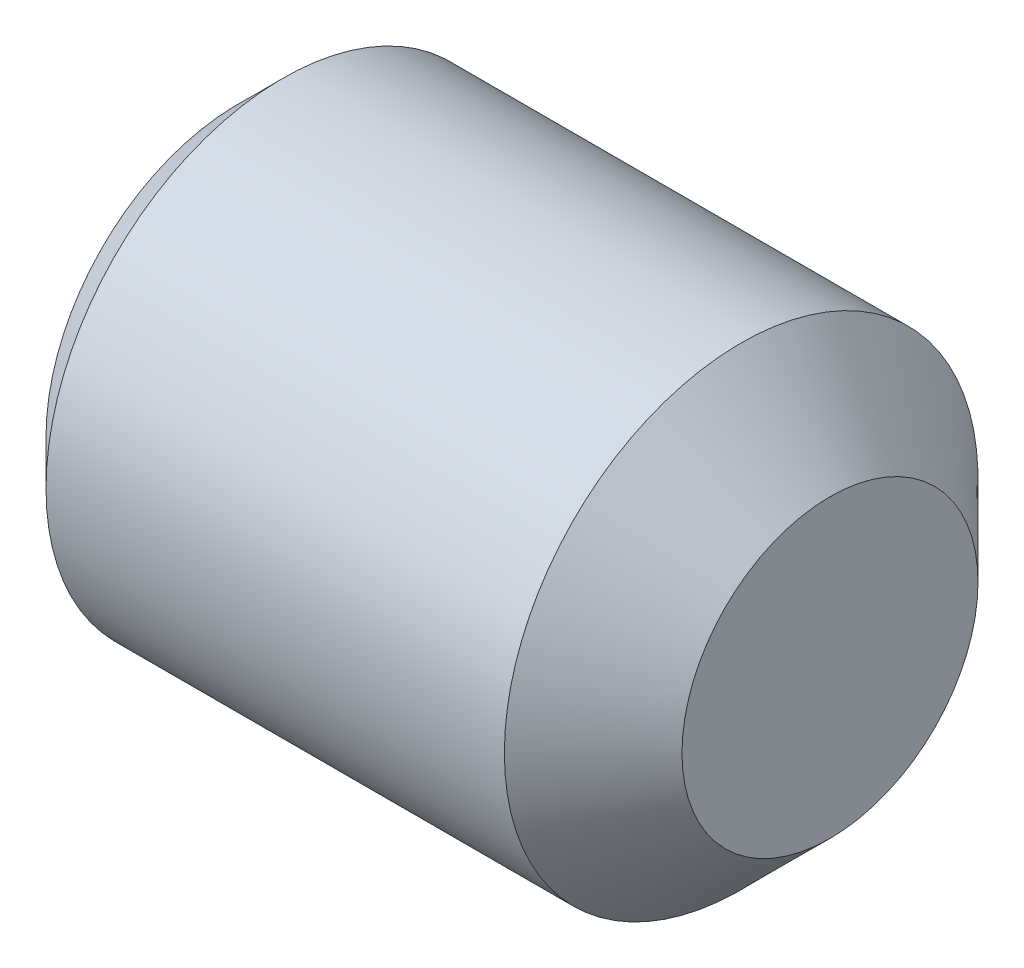
ISO-10303-21;
HEADER;
FILE_DESCRIPTION(('STEP AP214'),'2;1');
FILE_NAME('part.step','',(''),(''),'','','');
FILE_SCHEMA(('AUTOMOTIVE_DESIGN { 1 0 10303 214 1 1 1 1 }'));
ENDSEC;
DATA;
#1=APPLICATION_CONTEXT('core data for automotive mechanical design processes');
#2=APPLICATION_PROTOCOL_DEFINITION('international standard','automotive_design',2000,#1);
#3=PRODUCT_CONTEXT('',#1,'mechanical');
#4=PRODUCT('Part','Part','',(#3));
#5=PRODUCT_RELATED_PRODUCT_CATEGORY('part','',(#4));
#6=PRODUCT_DEFINITION_FORMATION('','',#4);
#7=PRODUCT_DEFINITION_CONTEXT('part definition',#1,'design');
#8=PRODUCT_DEFINITION('design','',#6,#7);
#9=PRODUCT_DEFINITION_SHAPE('','',#8);
#10=(LENGTH_UNIT() NAMED_UNIT(*) SI_UNIT(.MILLI.,.METRE.));
#11=(NAMED_UNIT(*) PLANE_ANGLE_UNIT() SI_UNIT($,.RADIAN.));
#12=(NAMED_UNIT(*) SI_UNIT($,.STERADIAN.) SOLID_ANGLE_UNIT());
#13=UNCERTAINTY_MEASURE_WITH_UNIT(LENGTH_MEASURE(1.E-05),#10,'distance_accuracy_value','');
#14=(GEOMETRIC_REPRESENTATION_CONTEXT(3) GLOBAL_UNCERTAINTY_ASSIGNED_CONTEXT((#13)) GLOBAL_UNIT_ASSIGNED_CONTEXT((#10,
#11,#12)) REPRESENTATION_CONTEXT('',''));
#15=CARTESIAN_POINT('',(0.,0.,0.));
#16=DIRECTION('',(0.,0.,1.));
#17=DIRECTION('',(1.,0.,0.));
#18=AXIS2_PLACEMENT_3D('',#15,#16,#17);
#19=CARTESIAN_POINT('',(0.,0.,0.));
#20=DIRECTION('',(1.,0.,0.));
#21=DIRECTION('',(0.,0.,-1.));
#22=AXIS2_PLACEMENT_3D('',#19,#20,#21);
#23=PLANE('',#22);
#24=CARTESIAN_POINT('',(0.,0.,0.));
#25=DIRECTION('',(-1.,0.,0.));
#26=DIRECTION('',(0.,0.,1.));
#27=AXIS2_PLACEMENT_3D('',#24,#25,#26);
#28=CIRCLE('',#27,1.621);
#29=CARTESIAN_POINT('',(0.,0.,1.621));
#30=VERTEX_POINT('',#29);
#31=EDGE_CURVE('E11',#30,#30,#28,.T.);
#32=ORIENTED_EDGE('',*,*,#31,.T.);
#33=EDGE_LOOP('',(#32));
#34=FACE_BOUND('',#33,.T.);
#35=DIRECTION('',(0.,-0.5,-0.866025403784439));
#36=VECTOR('',#35,1.);
#37=CARTESIAN_POINT('',(0.,1.15470053837925,0.));
#38=LINE('',#37,#36);
#39=CARTESIAN_POINT('',(0.,1.15470053837925,0.));
#40=VERTEX_POINT('',#39);
#41=CARTESIAN_POINT('',(0.,0.577350269189626,-1.));
#42=VERTEX_POINT('',#41);
#43=EDGE_CURVE('E149',#40,#42,#38,.T.);
#44=ORIENTED_EDGE('',*,*,#43,.F.);
#45=DIRECTION('',(0.,0.5,-0.866025403784439));
#46=VECTOR('',#45,1.);
#47=CARTESIAN_POINT('',(0.,0.577350269189626,1.));
#48=LINE('',#47,#46);
#49=CARTESIAN_POINT('',(0.,0.577350269189626,1.));
#50=VERTEX_POINT('',#49);
#51=EDGE_CURVE('E50',#50,#40,#48,.T.);
#52=ORIENTED_EDGE('',*,*,#51,.F.);
#53=DIRECTION('',(0.,1.,0.));
#54=VECTOR('',#53,1.);
#55=CARTESIAN_POINT('',(0.,-0.577350269189626,1.));
#56=LINE('',#55,#54);
#57=CARTESIAN_POINT('',(0.,-0.577350269189626,1.));
#58=VERTEX_POINT('',#57);
#59=EDGE_CURVE('E120',#58,#50,#56,.T.);
#60=ORIENTED_EDGE('',*,*,#59,.F.);
#61=DIRECTION('',(0.,0.5,0.866025403784439));
#62=VECTOR('',#61,1.);
#63=CARTESIAN_POINT('',(0.,-1.15470053837925,0.));
#64=LINE('',#63,#62);
#65=CARTESIAN_POINT('',(0.,-1.15470053837925,0.));
#66=VERTEX_POINT('',#65);
#67=EDGE_CURVE('E155',#66,#58,#64,.T.);
#68=ORIENTED_EDGE('',*,*,#67,.F.);
#69=DIRECTION('',(0.,-0.5,0.866025403784439));
#70=VECTOR('',#69,1.);
#71=CARTESIAN_POINT('',(0.,-0.577350269189626,-1.));
#72=LINE('',#71,#70);
#73=CARTESIAN_POINT('',(0.,-0.577350269189626,-1.));
#74=VERTEX_POINT('',#73);
#75=EDGE_CURVE('E153',#74,#66,#72,.T.);
#76=ORIENTED_EDGE('',*,*,#75,.F.);
#77=DIRECTION('',(0.,-1.,0.));
#78=VECTOR('',#77,1.);
#79=CARTESIAN_POINT('',(0.,0.577350269189626,-1.));
#80=LINE('',#79,#78);
#81=EDGE_CURVE('E151',#42,#74,#80,.T.);
#82=ORIENTED_EDGE('',*,*,#81,.F.);
#83=EDGE_LOOP('',(#44,#52,#60,#68,#76,#82));
#84=FACE_BOUND('',#83,.T.);
#85=ADVANCED_FACE('F36',(#34,#84),#23,.F.);
#86=CARTESIAN_POINT('',(0.378999999999999,0.,0.));
#87=DIRECTION('',(1.,0.,0.));
#88=DIRECTION('',(0.,0.,-1.));
#89=AXIS2_PLACEMENT_3D('',#86,#87,#88);
#90=CONICAL_SURFACE('',#89,2.,0.78539816339745);
#91=ORIENTED_EDGE('',*,*,#31,.F.);
#92=EDGE_LOOP('',(#91));
#93=FACE_BOUND('',#92,.T.);
#94=CARTESIAN_POINT('',(0.378999999999999,0.,0.));
#95=DIRECTION('',(-1.,0.,0.));
#96=DIRECTION('',(0.,0.,1.));
#97=AXIS2_PLACEMENT_3D('',#94,#95,#96);
#98=CIRCLE('',#97,2.);
#99=CARTESIAN_POINT('',(0.378999999999999,0.,2.));
#100=VERTEX_POINT('',#99);
#101=EDGE_CURVE('E43',#100,#100,#98,.T.);
#102=ORIENTED_EDGE('',*,*,#101,.T.);
#103=EDGE_LOOP('',(#102));
#104=FACE_BOUND('',#103,.T.);
#105=ADVANCED_FACE('F184',(#93,#104),#90,.T.);
#106=CARTESIAN_POINT('',(0.,0.,0.));
#107=DIRECTION('',(-1.,0.,0.));
#108=DIRECTION('',(0.,0.,1.));
#109=AXIS2_PLACEMENT_3D('',#106,#107,#108);
#110=CYLINDRICAL_SURFACE('',#109,2.);
#111=ORIENTED_EDGE('',*,*,#101,.F.);
#112=EDGE_LOOP('',(#111));
#113=FACE_BOUND('',#112,.T.);
#114=CARTESIAN_POINT('',(4.25,0.,0.));
#115=DIRECTION('',(-1.,0.,0.));
#116=DIRECTION('',(0.,0.,1.));
#117=AXIS2_PLACEMENT_3D('',#114,#115,#116);
#118=CIRCLE('',#117,2.);
#119=CARTESIAN_POINT('',(4.25,0.,2.));
#120=VERTEX_POINT('',#119);
#121=EDGE_CURVE('E179',#120,#120,#118,.T.);
#122=ORIENTED_EDGE('',*,*,#121,.T.);
#123=EDGE_LOOP('',(#122));
#124=FACE_BOUND('',#123,.T.);
#125=ADVANCED_FACE('F186',(#113,#124),#110,.T.);
#126=CARTESIAN_POINT('',(5.,0.,0.));
#127=DIRECTION('',(-1.,0.,0.));
#128=DIRECTION('',(0.,0.,1.));
#129=AXIS2_PLACEMENT_3D('',#126,#127,#128);
#130=CONICAL_SURFACE('',#129,1.25,0.785398163397446);
#131=ORIENTED_EDGE('',*,*,#121,.F.);
#132=EDGE_LOOP('',(#131));
#133=FACE_BOUND('',#132,.T.);
#134=CARTESIAN_POINT('',(5.,0.,0.));
#135=DIRECTION('',(-1.,0.,0.));
#136=DIRECTION('',(0.,0.,1.));
#137=AXIS2_PLACEMENT_3D('',#134,#135,#136);
#138=CIRCLE('',#137,1.25);
#139=CARTESIAN_POINT('',(5.,0.,1.25));
#140=VERTEX_POINT('',#139);
#141=EDGE_CURVE('E176',#140,#140,#138,.T.);
#142=ORIENTED_EDGE('',*,*,#141,.T.);
#143=EDGE_LOOP('',(#142));
#144=FACE_BOUND('',#143,.T.);
#145=ADVANCED_FACE('F189',(#133,#144),#130,.T.);
#146=CARTESIAN_POINT('',(5.,1.25,0.));
#147=DIRECTION('',(-1.,0.,0.));
#148=DIRECTION('',(0.,0.,1.));
#149=AXIS2_PLACEMENT_3D('',#146,#147,#148);
#150=PLANE('',#149);
#151=ORIENTED_EDGE('',*,*,#141,.F.);
#152=EDGE_LOOP('',(#151));
#153=FACE_BOUND('',#152,.T.);
#154=ADVANCED_FACE('F195',(#153),#150,.F.);
#155=CARTESIAN_POINT('',(2.5,0.577350269189626,1.));
#156=DIRECTION('',(0.,0.866025403784439,0.5));
#157=DIRECTION('',(0.,-0.5,0.866025403784439));
#158=AXIS2_PLACEMENT_3D('',#155,#156,#157);
#159=PLANE('',#158);
#160=DIRECTION('',(0.,0.5,-0.866025403784439));
#161=VECTOR('',#160,1.);
#162=CARTESIAN_POINT('',(2.5,0.577350269189626,1.));
#163=LINE('',#162,#161);
#164=CARTESIAN_POINT('',(2.5,0.577350269189626,1.));
#165=VERTEX_POINT('',#164);
#166=CARTESIAN_POINT('',(2.5,0.866025403784439,0.5));
#167=VERTEX_POINT('',#166);
#168=EDGE_CURVE('E119',#165,#167,#163,.T.);
#169=ORIENTED_EDGE('',*,*,#168,.F.);
#170=DIRECTION('',(-1.,0.,0.));
#171=VECTOR('',#170,1.);
#172=CARTESIAN_POINT('',(2.5,0.577350269189626,1.));
#173=LINE('',#172,#171);
#174=EDGE_CURVE('E159',#165,#50,#173,.T.);
#175=ORIENTED_EDGE('',*,*,#174,.T.);
#176=ORIENTED_EDGE('',*,*,#51,.T.);
#177=DIRECTION('',(-1.,0.,0.));
#178=VECTOR('',#177,1.);
#179=CARTESIAN_POINT('',(2.5,1.15470053837925,0.));
#180=LINE('',#179,#178);
#181=CARTESIAN_POINT('',(2.5,1.15470053837925,0.));
#182=VERTEX_POINT('',#181);
#183=EDGE_CURVE('E122',#182,#40,#180,.T.);
#184=ORIENTED_EDGE('',*,*,#183,.F.);
#185=EDGE_CURVE('E111',#167,#182,#163,.T.);
#186=ORIENTED_EDGE('',*,*,#185,.F.);
#187=EDGE_LOOP('',(#169,#175,#176,#184,#186));
#188=FACE_BOUND('',#187,.T.);
#189=ADVANCED_FACE('F123',(#188),#159,.F.);
#190=CARTESIAN_POINT('',(2.5,-0.577350269189626,1.));
#191=DIRECTION('',(0.,0.,1.));
#192=DIRECTION('',(1.,0.,0.));
#193=AXIS2_PLACEMENT_3D('',#190,#191,#192);
#194=PLANE('',#193);
#195=DIRECTION('',(0.,1.,0.));
#196=VECTOR('',#195,1.);
#197=CARTESIAN_POINT('',(2.5,-0.577350269189626,1.));
#198=LINE('',#197,#196);
#199=CARTESIAN_POINT('',(2.5,-0.577350269189626,1.));
#200=VERTEX_POINT('',#199);
#201=CARTESIAN_POINT('',(2.5,0.,1.));
#202=VERTEX_POINT('',#201);
#203=EDGE_CURVE('E58',#200,#202,#198,.T.);
#204=ORIENTED_EDGE('',*,*,#203,.F.);
#205=DIRECTION('',(-1.,0.,0.));
#206=VECTOR('',#205,1.);
#207=CARTESIAN_POINT('',(2.5,-0.577350269189626,1.));
#208=LINE('',#207,#206);
#209=EDGE_CURVE('E162',#200,#58,#208,.T.);
#210=ORIENTED_EDGE('',*,*,#209,.T.);
#211=ORIENTED_EDGE('',*,*,#59,.T.);
#212=ORIENTED_EDGE('',*,*,#174,.F.);
#213=EDGE_CURVE('E146',#202,#165,#198,.T.);
#214=ORIENTED_EDGE('',*,*,#213,.F.);
#215=EDGE_LOOP('',(#204,#210,#211,#212,#214));
#216=FACE_BOUND('',#215,.T.);
#217=ADVANCED_FACE('F204',(#216),#194,.F.);
#218=CARTESIAN_POINT('',(2.5,-1.15470053837925,0.));
#219=DIRECTION('',(0.,-0.866025403784439,0.5));
#220=DIRECTION('',(0.,-0.5,-0.866025403784439));
#221=AXIS2_PLACEMENT_3D('',#218,#219,#220);
#222=PLANE('',#221);
#223=DIRECTION('',(0.,0.5,0.866025403784439));
#224=VECTOR('',#223,1.);
#225=CARTESIAN_POINT('',(2.5,-1.15470053837925,0.));
#226=LINE('',#225,#224);
#227=CARTESIAN_POINT('',(2.5,-1.15470053837925,0.));
#228=VERTEX_POINT('',#227);
#229=CARTESIAN_POINT('',(2.5,-0.866025403784439,0.5));
#230=VERTEX_POINT('',#229);
#231=EDGE_CURVE('E143',#228,#230,#226,.T.);
#232=ORIENTED_EDGE('',*,*,#231,.F.);
#233=DIRECTION('',(-1.,0.,0.));
#234=VECTOR('',#233,1.);
#235=CARTESIAN_POINT('',(2.5,-1.15470053837925,0.));
#236=LINE('',#235,#234);
#237=EDGE_CURVE('E165',#228,#66,#236,.T.);
#238=ORIENTED_EDGE('',*,*,#237,.T.);
#239=ORIENTED_EDGE('',*,*,#67,.T.);
#240=ORIENTED_EDGE('',*,*,#209,.F.);
#241=EDGE_CURVE('E142',#230,#200,#226,.T.);
#242=ORIENTED_EDGE('',*,*,#241,.F.);
#243=EDGE_LOOP('',(#232,#238,#239,#240,#242));
#244=FACE_BOUND('',#243,.T.);
#245=ADVANCED_FACE('F240',(#244),#222,.F.);
#246=CARTESIAN_POINT('',(2.5,-0.577350269189626,-1.));
#247=DIRECTION('',(0.,-0.866025403784439,-0.5));
#248=DIRECTION('',(0.,0.5,-0.866025403784439));
#249=AXIS2_PLACEMENT_3D('',#246,#247,#248);
#250=PLANE('',#249);
#251=DIRECTION('',(0.,-0.5,0.866025403784439));
#252=VECTOR('',#251,1.);
#253=CARTESIAN_POINT('',(2.5,-0.577350269189626,-1.));
#254=LINE('',#253,#252);
#255=CARTESIAN_POINT('',(2.5,-0.577350269189626,-1.));
#256=VERTEX_POINT('',#255);
#257=CARTESIAN_POINT('',(2.5,-0.866025403784439,-0.5));
#258=VERTEX_POINT('',#257);
#259=EDGE_CURVE('E139',#256,#258,#254,.T.);
#260=ORIENTED_EDGE('',*,*,#259,.F.);
#261=DIRECTION('',(-1.,0.,0.));
#262=VECTOR('',#261,1.);
#263=CARTESIAN_POINT('',(2.5,-0.577350269189626,-1.));
#264=LINE('',#263,#262);
#265=EDGE_CURVE('E168',#256,#74,#264,.T.);
#266=ORIENTED_EDGE('',*,*,#265,.T.);
#267=ORIENTED_EDGE('',*,*,#75,.T.);
#268=ORIENTED_EDGE('',*,*,#237,.F.);
#269=EDGE_CURVE('E138',#258,#228,#254,.T.);
#270=ORIENTED_EDGE('',*,*,#269,.F.);
#271=EDGE_LOOP('',(#260,#266,#267,#268,#270));
#272=FACE_BOUND('',#271,.T.);
#273=ADVANCED_FACE('F247',(#272),#250,.F.);
#274=CARTESIAN_POINT('',(2.5,0.577350269189626,-1.));
#275=DIRECTION('',(0.,0.,-1.));
#276=DIRECTION('',(-1.,0.,0.));
#277=AXIS2_PLACEMENT_3D('',#274,#275,#276);
#278=PLANE('',#277);
#279=DIRECTION('',(0.,-1.,0.));
#280=VECTOR('',#279,1.);
#281=CARTESIAN_POINT('',(2.5,0.577350269189626,-1.));
#282=LINE('',#281,#280);
#283=CARTESIAN_POINT('',(2.5,0.577350269189626,-1.));
#284=VERTEX_POINT('',#283);
#285=CARTESIAN_POINT('',(2.5,0.,-1.));
#286=VERTEX_POINT('',#285);
#287=EDGE_CURVE('E134',#284,#286,#282,.T.);
#288=ORIENTED_EDGE('',*,*,#287,.F.);
#289=DIRECTION('',(-1.,0.,0.));
#290=VECTOR('',#289,1.);
#291=CARTESIAN_POINT('',(2.5,0.577350269189626,-1.));
#292=LINE('',#291,#290);
#293=EDGE_CURVE('E126',#284,#42,#292,.T.);
#294=ORIENTED_EDGE('',*,*,#293,.T.);
#295=ORIENTED_EDGE('',*,*,#81,.T.);
#296=ORIENTED_EDGE('',*,*,#265,.F.);
#297=EDGE_CURVE('E132',#286,#256,#282,.T.);
#298=ORIENTED_EDGE('',*,*,#297,.F.);
#299=EDGE_LOOP('',(#288,#294,#295,#296,#298));
#300=FACE_BOUND('',#299,.T.);
#301=ADVANCED_FACE('F219',(#300),#278,.F.);
#302=CARTESIAN_POINT('',(2.5,1.15470053837925,0.));
#303=DIRECTION('',(0.,0.866025403784439,-0.5));
#304=DIRECTION('',(0.,0.5,0.866025403784439));
#305=AXIS2_PLACEMENT_3D('',#302,#303,#304);
#306=PLANE('',#305);
#307=DIRECTION('',(0.,-0.5,-0.866025403784439));
#308=VECTOR('',#307,1.);
#309=CARTESIAN_POINT('',(2.5,1.15470053837925,0.));
#310=LINE('',#309,#308);
#311=CARTESIAN_POINT('',(2.5,0.866025403784439,-0.5));
#312=VERTEX_POINT('',#311);
#313=EDGE_CURVE('E114',#182,#312,#310,.T.);
#314=ORIENTED_EDGE('',*,*,#313,.F.);
#315=ORIENTED_EDGE('',*,*,#183,.T.);
#316=ORIENTED_EDGE('',*,*,#43,.T.);
#317=ORIENTED_EDGE('',*,*,#293,.F.);
#318=EDGE_CURVE('E131',#312,#284,#310,.T.);
#319=ORIENTED_EDGE('',*,*,#318,.F.);
#320=EDGE_LOOP('',(#314,#315,#316,#317,#319));
#321=FACE_BOUND('',#320,.T.);
#322=ADVANCED_FACE('F129',(#321),#306,.F.);
#323=CARTESIAN_POINT('',(2.5,0.,0.));
#324=DIRECTION('',(-1.,0.,0.));
#325=DIRECTION('',(0.,0.,1.));
#326=AXIS2_PLACEMENT_3D('',#323,#324,#325);
#327=PLANE('',#326);
#328=ORIENTED_EDGE('',*,*,#213,.T.);
#329=ORIENTED_EDGE('',*,*,#168,.T.);
#330=CARTESIAN_POINT('',(2.5,0.,0.));
#331=DIRECTION('',(-1.,0.,0.));
#332=DIRECTION('',(0.,0.,1.));
#333=AXIS2_PLACEMENT_3D('',#330,#331,#332);
#334=CIRCLE('',#333,1.);
#335=EDGE_CURVE('E173',#202,#167,#334,.T.);
#336=ORIENTED_EDGE('',*,*,#335,.F.);
#337=EDGE_LOOP('',(#328,#329,#336));
#338=FACE_BOUND('',#337,.T.);
#339=ADVANCED_FACE('F252',(#338),#327,.T.);
#340=ORIENTED_EDGE('',*,*,#185,.T.);
#341=ORIENTED_EDGE('',*,*,#313,.T.);
#342=EDGE_CURVE('E116',#167,#312,#334,.T.);
#343=ORIENTED_EDGE('',*,*,#342,.F.);
#344=EDGE_LOOP('',(#340,#341,#343));
#345=FACE_BOUND('',#344,.T.);
#346=ADVANCED_FACE('F112',(#345),#327,.T.);
#347=ORIENTED_EDGE('',*,*,#318,.T.);
#348=ORIENTED_EDGE('',*,*,#287,.T.);
#349=EDGE_CURVE('E225',#312,#286,#334,.T.);
#350=ORIENTED_EDGE('',*,*,#349,.F.);
#351=EDGE_LOOP('',(#347,#348,#350));
#352=FACE_BOUND('',#351,.T.);
#353=ADVANCED_FACE('F224',(#352),#327,.T.);
#354=ORIENTED_EDGE('',*,*,#297,.T.);
#355=ORIENTED_EDGE('',*,*,#259,.T.);
#356=EDGE_CURVE('E231',#286,#258,#334,.T.);
#357=ORIENTED_EDGE('',*,*,#356,.F.);
#358=EDGE_LOOP('',(#354,#355,#357));
#359=FACE_BOUND('',#358,.T.);
#360=ADVANCED_FACE('F266',(#359),#327,.T.);
#361=ORIENTED_EDGE('',*,*,#269,.T.);
#362=ORIENTED_EDGE('',*,*,#231,.T.);
#363=EDGE_CURVE('E232',#258,#230,#334,.T.);
#364=ORIENTED_EDGE('',*,*,#363,.F.);
#365=EDGE_LOOP('',(#361,#362,#364));
#366=FACE_BOUND('',#365,.T.);
#367=ADVANCED_FACE('F242',(#366),#327,.T.);
#368=ORIENTED_EDGE('',*,*,#241,.T.);
#369=ORIENTED_EDGE('',*,*,#203,.T.);
#370=EDGE_CURVE('E161',#230,#202,#334,.T.);
#371=ORIENTED_EDGE('',*,*,#370,.F.);
#372=EDGE_LOOP('',(#368,#369,#371));
#373=FACE_BOUND('',#372,.T.);
#374=ADVANCED_FACE('F236',(#373),#327,.T.);
#375=CARTESIAN_POINT('',(3.07735026918963,0.,0.));
#376=DIRECTION('',(-1.,0.,0.));
#377=DIRECTION('',(0.,0.,1.));
#378=AXIS2_PLACEMENT_3D('',#375,#376,#377);
#379=CONICAL_SURFACE('',#378,0.,1.04719755119659);
#380=ORIENTED_EDGE('',*,*,#335,.T.);
#381=ORIENTED_EDGE('',*,*,#342,.T.);
#382=ORIENTED_EDGE('',*,*,#349,.T.);
#383=ORIENTED_EDGE('',*,*,#356,.T.);
#384=ORIENTED_EDGE('',*,*,#363,.T.);
#385=ORIENTED_EDGE('',*,*,#370,.T.);
#386=EDGE_LOOP('',(#380,#381,#382,#383,#384,#385));
#387=FACE_BOUND('',#386,.T.);
#388=CARTESIAN_POINT('',(3.07735026918963,0.,0.));
#389=VERTEX_POINT('',#388);
#390=VERTEX_LOOP('',#389);
#391=FACE_BOUND('',#390,.T.);
#392=ADVANCED_FACE('F228',(#387,#391),#379,.F.);
#393=CLOSED_SHELL('',(#85,#105,#125,#145,#154,#189,#217,#245,#273,#301,#322,#339,#346,#353,#360,
#367,#374,#392));
#394=MANIFOLD_SOLID_BREP('B2',#393);
#395=ADVANCED_BREP_SHAPE_REPRESENTATION('',(#18,#394),#14);
#396=SHAPE_DEFINITION_REPRESENTATION(#9,#395);
ENDSEC;
END-ISO-10303-21;
